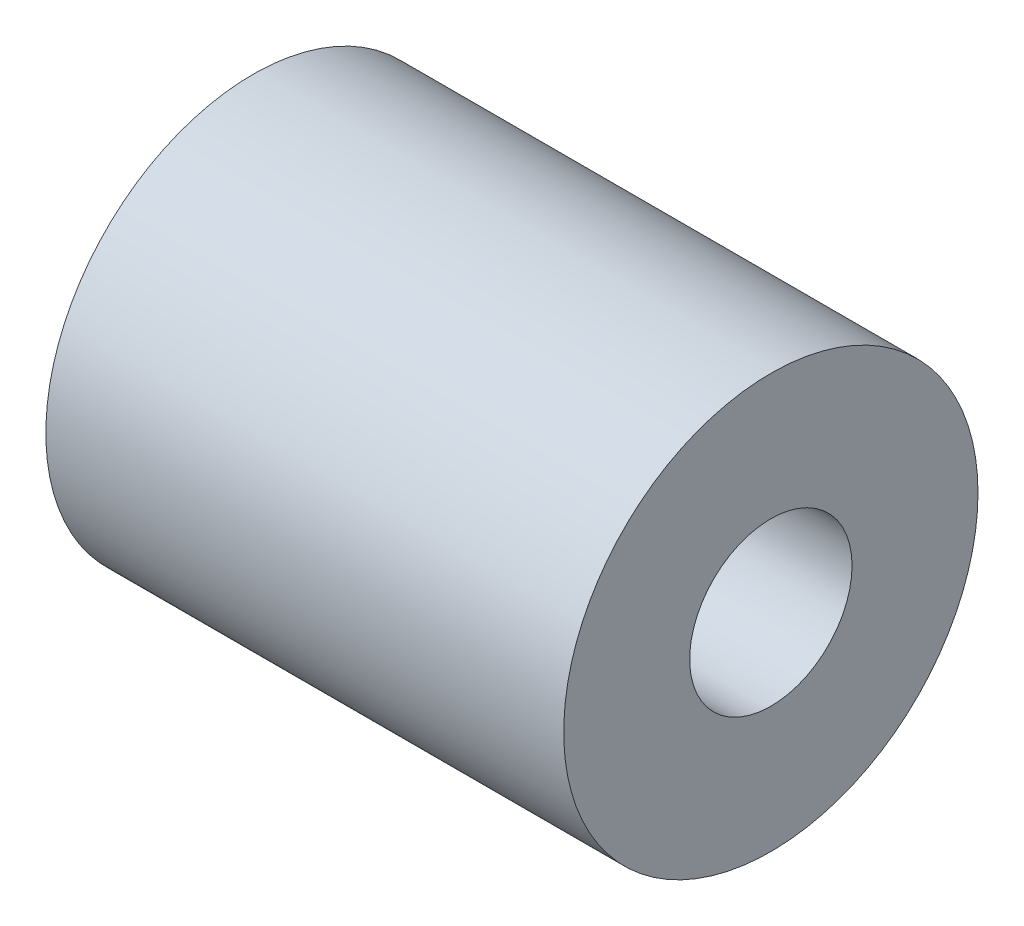
ISO-10303-21;
HEADER;
FILE_DESCRIPTION(('STEP AP214'),'2;1');
FILE_NAME('part.step','',(''),(''),'','','');
FILE_SCHEMA(('AUTOMOTIVE_DESIGN { 1 0 10303 214 1 1 1 1 }'));
ENDSEC;
DATA;
#1=APPLICATION_CONTEXT('core data for automotive mechanical design processes');
#2=APPLICATION_PROTOCOL_DEFINITION('international standard','automotive_design',2000,#1);
#3=PRODUCT_CONTEXT('',#1,'mechanical');
#4=PRODUCT('Part','Part','',(#3));
#5=PRODUCT_RELATED_PRODUCT_CATEGORY('part','',(#4));
#6=PRODUCT_DEFINITION_FORMATION('','',#4);
#7=PRODUCT_DEFINITION_CONTEXT('part definition',#1,'design');
#8=PRODUCT_DEFINITION('design','',#6,#7);
#9=PRODUCT_DEFINITION_SHAPE('','',#8);
#10=(LENGTH_UNIT() NAMED_UNIT(*) SI_UNIT(.MILLI.,.METRE.));
#11=(NAMED_UNIT(*) PLANE_ANGLE_UNIT() SI_UNIT($,.RADIAN.));
#12=(NAMED_UNIT(*) SI_UNIT($,.STERADIAN.) SOLID_ANGLE_UNIT());
#13=UNCERTAINTY_MEASURE_WITH_UNIT(LENGTH_MEASURE(1.E-05),#10,'distance_accuracy_value','');
#14=(GEOMETRIC_REPRESENTATION_CONTEXT(3) GLOBAL_UNCERTAINTY_ASSIGNED_CONTEXT((#13)) GLOBAL_UNIT_ASSIGNED_CONTEXT((#10,
#11,#12)) REPRESENTATION_CONTEXT('',''));
#15=CARTESIAN_POINT('',(0.,0.,0.));
#16=DIRECTION('',(0.,0.,1.));
#17=DIRECTION('',(1.,0.,0.));
#18=AXIS2_PLACEMENT_3D('',#15,#16,#17);
#19=CARTESIAN_POINT('',(15.875,0.,0.));
#20=DIRECTION('',(1.,0.,0.));
#21=DIRECTION('',(0.,0.,-1.));
#22=AXIS2_PLACEMENT_3D('',#19,#20,#21);
#23=PLANE('',#22);
#24=CARTESIAN_POINT('',(15.875,0.,0.));
#25=DIRECTION('',(1.,0.,0.));
#26=DIRECTION('',(0.,0.,-1.));
#27=AXIS2_PLACEMENT_3D('',#24,#25,#26);
#28=CIRCLE('',#27,6.35);
#29=CARTESIAN_POINT('',(15.875,0.,-6.35));
#30=VERTEX_POINT('',#29);
#31=EDGE_CURVE('E10',#30,#30,#28,.T.);
#32=ORIENTED_EDGE('',*,*,#31,.T.);
#33=EDGE_LOOP('',(#32));
#34=FACE_BOUND('',#33,.T.);
#35=CARTESIAN_POINT('',(15.875,0.,0.));
#36=DIRECTION('',(1.,0.,0.));
#37=DIRECTION('',(0.,0.,-1.));
#38=AXIS2_PLACEMENT_3D('',#35,#36,#37);
#39=CIRCLE('',#38,2.4892);
#40=CARTESIAN_POINT('',(15.875,0.,-2.4892));
#41=VERTEX_POINT('',#40);
#42=EDGE_CURVE('E45',#41,#41,#39,.T.);
#43=ORIENTED_EDGE('',*,*,#42,.F.);
#44=EDGE_LOOP('',(#43));
#45=FACE_BOUND('',#44,.T.);
#46=ADVANCED_FACE('F34',(#34,#45),#23,.T.);
#47=CARTESIAN_POINT('',(0.,0.,0.));
#48=DIRECTION('',(1.,0.,0.));
#49=DIRECTION('',(0.,0.,-1.));
#50=AXIS2_PLACEMENT_3D('',#47,#48,#49);
#51=PLANE('',#50);
#52=CARTESIAN_POINT('',(0.,0.,0.));
#53=DIRECTION('',(1.,0.,0.));
#54=DIRECTION('',(0.,0.,-1.));
#55=AXIS2_PLACEMENT_3D('',#52,#53,#54);
#56=CIRCLE('',#55,6.35);
#57=CARTESIAN_POINT('',(0.,0.,-6.35));
#58=VERTEX_POINT('',#57);
#59=EDGE_CURVE('E38',#58,#58,#56,.T.);
#60=ORIENTED_EDGE('',*,*,#59,.F.);
#61=EDGE_LOOP('',(#60));
#62=FACE_BOUND('',#61,.T.);
#63=CARTESIAN_POINT('',(0.,0.,0.));
#64=DIRECTION('',(1.,0.,0.));
#65=DIRECTION('',(0.,0.,-1.));
#66=AXIS2_PLACEMENT_3D('',#63,#64,#65);
#67=CIRCLE('',#66,2.4892);
#68=CARTESIAN_POINT('',(0.,0.,-2.4892));
#69=VERTEX_POINT('',#68);
#70=EDGE_CURVE('E47',#69,#69,#67,.T.);
#71=ORIENTED_EDGE('',*,*,#70,.T.);
#72=EDGE_LOOP('',(#71));
#73=FACE_BOUND('',#72,.T.);
#74=ADVANCED_FACE('F57',(#62,#73),#51,.F.);
#75=CARTESIAN_POINT('',(15.875,0.,0.));
#76=DIRECTION('',(-1.,0.,0.));
#77=DIRECTION('',(0.,0.,1.));
#78=AXIS2_PLACEMENT_3D('',#75,#76,#77);
#79=CYLINDRICAL_SURFACE('',#78,6.35);
#80=ORIENTED_EDGE('',*,*,#31,.F.);
#81=EDGE_LOOP('',(#80));
#82=FACE_BOUND('',#81,.T.);
#83=ORIENTED_EDGE('',*,*,#59,.T.);
#84=EDGE_LOOP('',(#83));
#85=FACE_BOUND('',#84,.T.);
#86=ADVANCED_FACE('F36',(#82,#85),#79,.T.);
#87=CARTESIAN_POINT('',(15.875,0.,0.));
#88=DIRECTION('',(-1.,0.,0.));
#89=DIRECTION('',(0.,0.,1.));
#90=AXIS2_PLACEMENT_3D('',#87,#88,#89);
#91=CYLINDRICAL_SURFACE('',#90,2.4892);
#92=ORIENTED_EDGE('',*,*,#42,.T.);
#93=EDGE_LOOP('',(#92));
#94=FACE_BOUND('',#93,.T.);
#95=ORIENTED_EDGE('',*,*,#70,.F.);
#96=EDGE_LOOP('',(#95));
#97=FACE_BOUND('',#96,.T.);
#98=ADVANCED_FACE('F53',(#94,#97),#91,.F.);
#99=CLOSED_SHELL('',(#46,#74,#86,#98));
#100=MANIFOLD_SOLID_BREP('B2',#99);
#101=ADVANCED_BREP_SHAPE_REPRESENTATION('',(#18,#100),#14);
#102=SHAPE_DEFINITION_REPRESENTATION(#9,#101);
ENDSEC;
END-ISO-10303-21;
